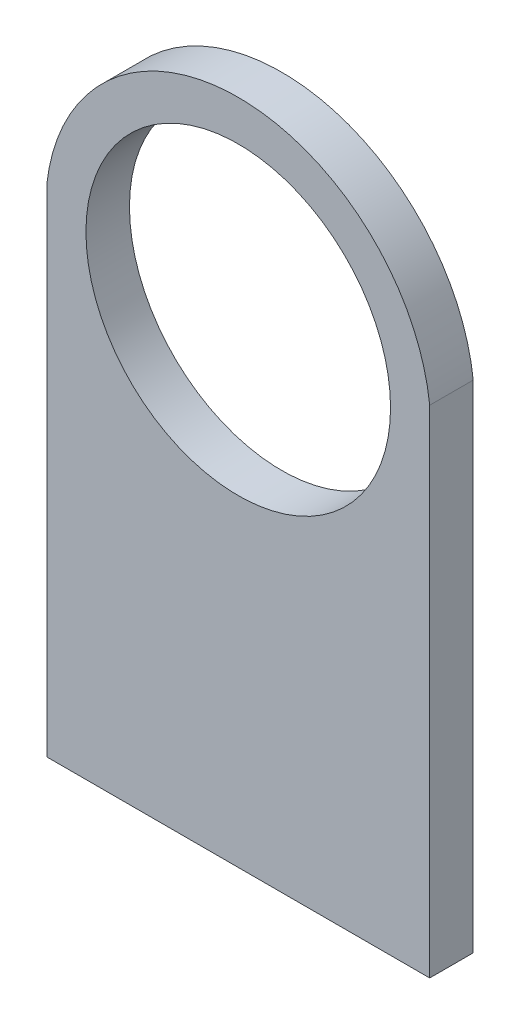
ISO-10303-21;
HEADER;
FILE_DESCRIPTION(('STEP AP214'),'2;1');
FILE_NAME('part.step','',(''),(''),'','','');
FILE_SCHEMA(('AUTOMOTIVE_DESIGN { 1 0 10303 214 1 1 1 1 }'));
ENDSEC;
DATA;
#1=APPLICATION_CONTEXT('core data for automotive mechanical design processes');
#2=APPLICATION_PROTOCOL_DEFINITION('international standard','automotive_design',2000,#1);
#3=PRODUCT_CONTEXT('',#1,'mechanical');
#4=PRODUCT('Part','Part','',(#3));
#5=PRODUCT_RELATED_PRODUCT_CATEGORY('part','',(#4));
#6=PRODUCT_DEFINITION_FORMATION('','',#4);
#7=PRODUCT_DEFINITION_CONTEXT('part definition',#1,'design');
#8=PRODUCT_DEFINITION('design','',#6,#7);
#9=PRODUCT_DEFINITION_SHAPE('','',#8);
#10=(LENGTH_UNIT() NAMED_UNIT(*) SI_UNIT(.MILLI.,.METRE.));
#11=(NAMED_UNIT(*) PLANE_ANGLE_UNIT() SI_UNIT($,.RADIAN.));
#12=(NAMED_UNIT(*) SI_UNIT($,.STERADIAN.) SOLID_ANGLE_UNIT());
#13=UNCERTAINTY_MEASURE_WITH_UNIT(LENGTH_MEASURE(1.E-05),#10,'distance_accuracy_value','');
#14=(GEOMETRIC_REPRESENTATION_CONTEXT(3) GLOBAL_UNCERTAINTY_ASSIGNED_CONTEXT((#13)) GLOBAL_UNIT_ASSIGNED_CONTEXT((#10,
#11,#12)) REPRESENTATION_CONTEXT('',''));
#15=CARTESIAN_POINT('',(0.,0.,0.));
#16=DIRECTION('',(0.,0.,1.));
#17=DIRECTION('',(1.,0.,0.));
#18=AXIS2_PLACEMENT_3D('',#15,#16,#17);
#19=CARTESIAN_POINT('',(22.,-2.5,5.));
#20=DIRECTION('',(0.,0.,-1.));
#21=DIRECTION('',(-1.,0.,0.));
#22=AXIS2_PLACEMENT_3D('',#19,#20,#21);
#23=PLANE('',#22);
#24=CARTESIAN_POINT('',(22.,-2.5,5.));
#25=DIRECTION('',(0.,0.,1.));
#26=DIRECTION('',(-1.,0.,0.));
#27=AXIS2_PLACEMENT_3D('',#24,#25,#26);
#28=CIRCLE('',#27,22.1415898254845);
#29=CARTESIAN_POINT('',(44.,0.,5.));
#30=VERTEX_POINT('',#29);
#31=CARTESIAN_POINT('',(0.,0.,5.));
#32=VERTEX_POINT('',#31);
#33=EDGE_CURVE('E91',#30,#32,#28,.T.);
#34=ORIENTED_EDGE('',*,*,#33,.T.);
#35=DIRECTION('',(0.,-1.,0.));
#36=VECTOR('',#35,1.);
#37=CARTESIAN_POINT('',(0.,0.,5.));
#38=LINE('',#37,#36);
#39=CARTESIAN_POINT('',(0.,-57.,5.));
#40=VERTEX_POINT('',#39);
#41=EDGE_CURVE('E86',#32,#40,#38,.T.);
#42=ORIENTED_EDGE('',*,*,#41,.T.);
#43=DIRECTION('',(1.,0.,0.));
#44=VECTOR('',#43,1.);
#45=CARTESIAN_POINT('',(0.,-57.,5.));
#46=LINE('',#45,#44);
#47=CARTESIAN_POINT('',(44.,-57.,5.));
#48=VERTEX_POINT('',#47);
#49=EDGE_CURVE('E89',#40,#48,#46,.T.);
#50=ORIENTED_EDGE('',*,*,#49,.T.);
#51=DIRECTION('',(0.,1.,0.));
#52=VECTOR('',#51,1.);
#53=CARTESIAN_POINT('',(44.,-57.,5.));
#54=LINE('',#53,#52);
#55=EDGE_CURVE('E56',#48,#30,#54,.T.);
#56=ORIENTED_EDGE('',*,*,#55,.T.);
#57=EDGE_LOOP('',(#34,#42,#50,#56));
#58=FACE_BOUND('',#57,.T.);
#59=CARTESIAN_POINT('',(22.,-2.5,5.));
#60=DIRECTION('',(0.,0.,1.));
#61=DIRECTION('',(1.,0.,0.));
#62=AXIS2_PLACEMENT_3D('',#59,#60,#61);
#63=CIRCLE('',#62,17.5);
#64=CARTESIAN_POINT('',(39.5,-2.5,5.));
#65=VERTEX_POINT('',#64);
#66=EDGE_CURVE('E112',#65,#65,#63,.T.);
#67=ORIENTED_EDGE('',*,*,#66,.F.);
#68=EDGE_LOOP('',(#67));
#69=FACE_BOUND('',#68,.T.);
#70=ADVANCED_FACE('F38',(#58,#69),#23,.F.);
#71=CARTESIAN_POINT('',(22.,-2.5,0.));
#72=DIRECTION('',(0.,0.,-1.));
#73=DIRECTION('',(-1.,0.,0.));
#74=AXIS2_PLACEMENT_3D('',#71,#72,#73);
#75=PLANE('',#74);
#76=CARTESIAN_POINT('',(22.,-2.5,0.));
#77=DIRECTION('',(0.,0.,1.));
#78=DIRECTION('',(-1.,0.,0.));
#79=AXIS2_PLACEMENT_3D('',#76,#77,#78);
#80=CIRCLE('',#79,22.1415898254845);
#81=CARTESIAN_POINT('',(44.,0.,0.));
#82=VERTEX_POINT('',#81);
#83=CARTESIAN_POINT('',(0.,0.,0.));
#84=VERTEX_POINT('',#83);
#85=EDGE_CURVE('E108',#82,#84,#80,.T.);
#86=ORIENTED_EDGE('',*,*,#85,.F.);
#87=DIRECTION('',(0.,1.,0.));
#88=VECTOR('',#87,1.);
#89=CARTESIAN_POINT('',(44.,-57.,0.));
#90=LINE('',#89,#88);
#91=CARTESIAN_POINT('',(44.,-57.,0.));
#92=VERTEX_POINT('',#91);
#93=EDGE_CURVE('E79',#92,#82,#90,.T.);
#94=ORIENTED_EDGE('',*,*,#93,.F.);
#95=DIRECTION('',(1.,0.,0.));
#96=VECTOR('',#95,1.);
#97=CARTESIAN_POINT('',(0.,-57.,0.));
#98=LINE('',#97,#96);
#99=CARTESIAN_POINT('',(0.,-57.,0.));
#100=VERTEX_POINT('',#99);
#101=EDGE_CURVE('E73',#100,#92,#98,.T.);
#102=ORIENTED_EDGE('',*,*,#101,.F.);
#103=DIRECTION('',(0.,-1.,0.));
#104=VECTOR('',#103,1.);
#105=CARTESIAN_POINT('',(0.,0.,0.));
#106=LINE('',#105,#104);
#107=EDGE_CURVE('E96',#84,#100,#106,.T.);
#108=ORIENTED_EDGE('',*,*,#107,.F.);
#109=EDGE_LOOP('',(#86,#94,#102,#108));
#110=FACE_BOUND('',#109,.T.);
#111=CARTESIAN_POINT('',(22.,-2.5,0.));
#112=DIRECTION('',(0.,0.,1.));
#113=DIRECTION('',(1.,0.,0.));
#114=AXIS2_PLACEMENT_3D('',#111,#112,#113);
#115=CIRCLE('',#114,17.5);
#116=CARTESIAN_POINT('',(39.5,-2.5,0.));
#117=VERTEX_POINT('',#116);
#118=EDGE_CURVE('E132',#117,#117,#115,.T.);
#119=ORIENTED_EDGE('',*,*,#118,.T.);
#120=EDGE_LOOP('',(#119));
#121=FACE_BOUND('',#120,.T.);
#122=ADVANCED_FACE('F126',(#110,#121),#75,.T.);
#123=CARTESIAN_POINT('',(22.,-2.5,5.));
#124=DIRECTION('',(0.,0.,-1.));
#125=DIRECTION('',(-1.,0.,0.));
#126=AXIS2_PLACEMENT_3D('',#123,#124,#125);
#127=CYLINDRICAL_SURFACE('',#126,22.1415898254845);
#128=ORIENTED_EDGE('',*,*,#85,.T.);
#129=DIRECTION('',(0.,0.,-1.));
#130=VECTOR('',#129,1.);
#131=CARTESIAN_POINT('',(0.,0.,5.));
#132=LINE('',#131,#130);
#133=EDGE_CURVE('E11',#32,#84,#132,.T.);
#134=ORIENTED_EDGE('',*,*,#133,.F.);
#135=ORIENTED_EDGE('',*,*,#33,.F.);
#136=DIRECTION('',(0.,0.,-1.));
#137=VECTOR('',#136,1.);
#138=CARTESIAN_POINT('',(44.,0.,5.));
#139=LINE('',#138,#137);
#140=EDGE_CURVE('E104',#30,#82,#139,.T.);
#141=ORIENTED_EDGE('',*,*,#140,.T.);
#142=EDGE_LOOP('',(#128,#134,#135,#141));
#143=FACE_BOUND('',#142,.T.);
#144=ADVANCED_FACE('F40',(#143),#127,.T.);
#145=CARTESIAN_POINT('',(0.,0.,5.));
#146=DIRECTION('',(1.,0.,0.));
#147=DIRECTION('',(0.,1.,0.));
#148=AXIS2_PLACEMENT_3D('',#145,#146,#147);
#149=PLANE('',#148);
#150=ORIENTED_EDGE('',*,*,#107,.T.);
#151=DIRECTION('',(0.,0.,-1.));
#152=VECTOR('',#151,1.);
#153=CARTESIAN_POINT('',(0.,-57.,5.));
#154=LINE('',#153,#152);
#155=EDGE_CURVE('E48',#40,#100,#154,.T.);
#156=ORIENTED_EDGE('',*,*,#155,.F.);
#157=ORIENTED_EDGE('',*,*,#41,.F.);
#158=ORIENTED_EDGE('',*,*,#133,.T.);
#159=EDGE_LOOP('',(#150,#156,#157,#158));
#160=FACE_BOUND('',#159,.T.);
#161=ADVANCED_FACE('F95',(#160),#149,.F.);
#162=CARTESIAN_POINT('',(0.,-57.,5.));
#163=DIRECTION('',(0.,1.,0.));
#164=DIRECTION('',(0.,0.,1.));
#165=AXIS2_PLACEMENT_3D('',#162,#163,#164);
#166=PLANE('',#165);
#167=ORIENTED_EDGE('',*,*,#101,.T.);
#168=DIRECTION('',(0.,0.,-1.));
#169=VECTOR('',#168,1.);
#170=CARTESIAN_POINT('',(44.,-57.,5.));
#171=LINE('',#170,#169);
#172=EDGE_CURVE('E98',#48,#92,#171,.T.);
#173=ORIENTED_EDGE('',*,*,#172,.F.);
#174=ORIENTED_EDGE('',*,*,#49,.F.);
#175=ORIENTED_EDGE('',*,*,#155,.T.);
#176=EDGE_LOOP('',(#167,#173,#174,#175));
#177=FACE_BOUND('',#176,.T.);
#178=ADVANCED_FACE('F99',(#177),#166,.F.);
#179=CARTESIAN_POINT('',(44.,-57.,5.));
#180=DIRECTION('',(-1.,0.,0.));
#181=DIRECTION('',(0.,0.,1.));
#182=AXIS2_PLACEMENT_3D('',#179,#180,#181);
#183=PLANE('',#182);
#184=ORIENTED_EDGE('',*,*,#93,.T.);
#185=ORIENTED_EDGE('',*,*,#140,.F.);
#186=ORIENTED_EDGE('',*,*,#55,.F.);
#187=ORIENTED_EDGE('',*,*,#172,.T.);
#188=EDGE_LOOP('',(#184,#185,#186,#187));
#189=FACE_BOUND('',#188,.T.);
#190=ADVANCED_FACE('F123',(#189),#183,.F.);
#191=CARTESIAN_POINT('',(22.,-2.5,5.));
#192=DIRECTION('',(0.,0.,-1.));
#193=DIRECTION('',(-1.,0.,0.));
#194=AXIS2_PLACEMENT_3D('',#191,#192,#193);
#195=CYLINDRICAL_SURFACE('',#194,17.5);
#196=ORIENTED_EDGE('',*,*,#66,.T.);
#197=EDGE_LOOP('',(#196));
#198=FACE_BOUND('',#197,.T.);
#199=ORIENTED_EDGE('',*,*,#118,.F.);
#200=EDGE_LOOP('',(#199));
#201=FACE_BOUND('',#200,.T.);
#202=ADVANCED_FACE('F142',(#198,#201),#195,.F.);
#203=CLOSED_SHELL('',(#70,#122,#144,#161,#178,#190,#202));
#204=MANIFOLD_SOLID_BREP('B2',#203);
#205=ADVANCED_BREP_SHAPE_REPRESENTATION('',(#18,#204),#14);
#206=SHAPE_DEFINITION_REPRESENTATION(#9,#205);
ENDSEC;
END-ISO-10303-21;
